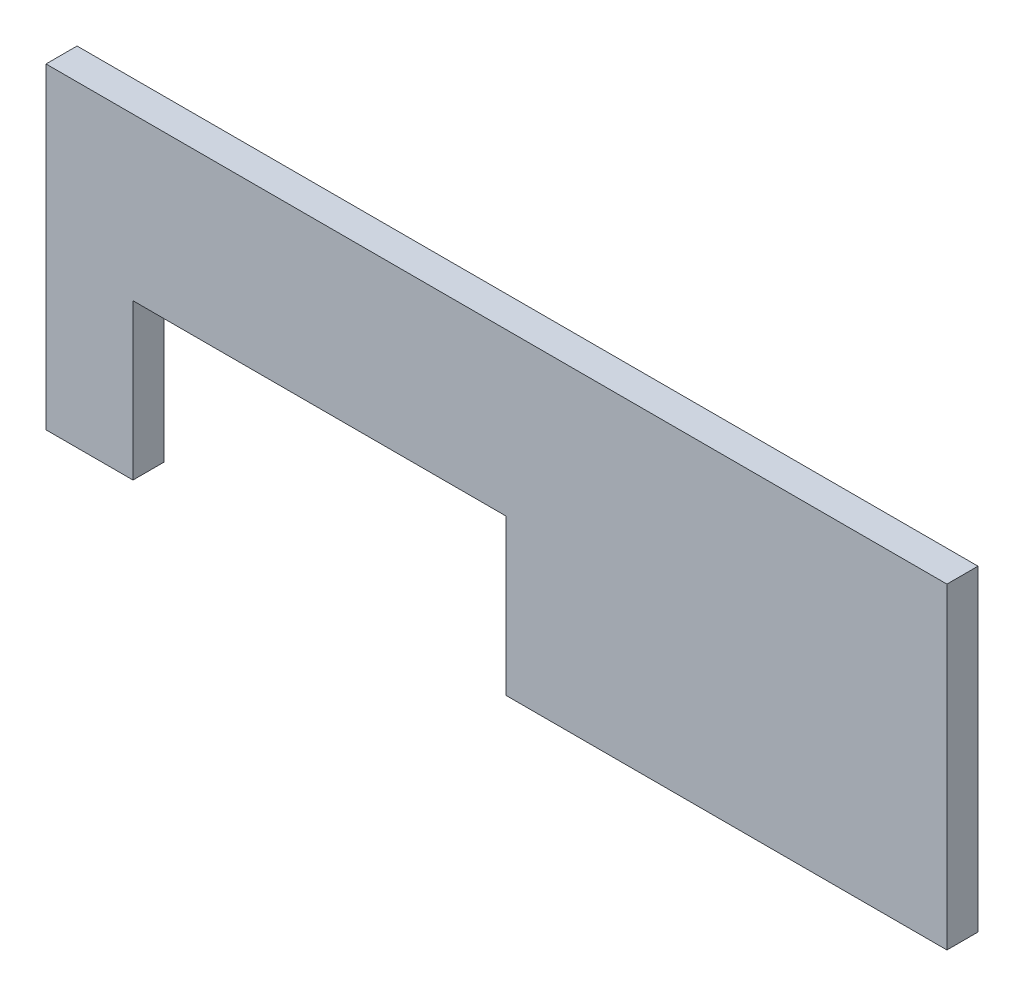
ISO-10303-21;
HEADER;
FILE_DESCRIPTION(('STEP AP214'),'2;1');
FILE_NAME('part.step','',(''),(''),'','','');
FILE_SCHEMA(('AUTOMOTIVE_DESIGN { 1 0 10303 214 1 1 1 1 }'));
ENDSEC;
DATA;
#1=APPLICATION_CONTEXT('core data for automotive mechanical design processes');
#2=APPLICATION_PROTOCOL_DEFINITION('international standard','automotive_design',2000,#1);
#3=PRODUCT_CONTEXT('',#1,'mechanical');
#4=PRODUCT('Part','Part','',(#3));
#5=PRODUCT_RELATED_PRODUCT_CATEGORY('part','',(#4));
#6=PRODUCT_DEFINITION_FORMATION('','',#4);
#7=PRODUCT_DEFINITION_CONTEXT('part definition',#1,'design');
#8=PRODUCT_DEFINITION('design','',#6,#7);
#9=PRODUCT_DEFINITION_SHAPE('','',#8);
#10=(LENGTH_UNIT() NAMED_UNIT(*) SI_UNIT(.MILLI.,.METRE.));
#11=(NAMED_UNIT(*) PLANE_ANGLE_UNIT() SI_UNIT($,.RADIAN.));
#12=(NAMED_UNIT(*) SI_UNIT($,.STERADIAN.) SOLID_ANGLE_UNIT());
#13=UNCERTAINTY_MEASURE_WITH_UNIT(LENGTH_MEASURE(1.E-05),#10,'distance_accuracy_value','');
#14=(GEOMETRIC_REPRESENTATION_CONTEXT(3) GLOBAL_UNCERTAINTY_ASSIGNED_CONTEXT((#13)) GLOBAL_UNIT_ASSIGNED_CONTEXT((#10,
#11,#12)) REPRESENTATION_CONTEXT('',''));
#15=CARTESIAN_POINT('',(0.,0.,0.));
#16=DIRECTION('',(0.,0.,1.));
#17=DIRECTION('',(1.,0.,0.));
#18=AXIS2_PLACEMENT_3D('',#15,#16,#17);
#19=CARTESIAN_POINT('',(-48.7494483294484,2.8376923076923,5.));
#20=DIRECTION('',(1.,0.,0.));
#21=DIRECTION('',(0.,1.,0.));
#22=AXIS2_PLACEMENT_3D('',#19,#20,#21);
#23=PLANE('',#22);
#24=DIRECTION('',(0.,-1.,0.));
#25=VECTOR('',#24,1.);
#26=CARTESIAN_POINT('',(-48.7494483294484,2.8376923076923,0.));
#27=LINE('',#26,#25);
#28=CARTESIAN_POINT('',(-48.7494483294484,2.8376923076923,0.));
#29=VERTEX_POINT('',#28);
#30=CARTESIAN_POINT('',(-48.7494483294484,-48.1623076923077,0.));
#31=VERTEX_POINT('',#30);
#32=EDGE_CURVE('E126',#29,#31,#27,.T.);
#33=ORIENTED_EDGE('',*,*,#32,.T.);
#34=DIRECTION('',(0.,0.,-1.));
#35=VECTOR('',#34,1.);
#36=CARTESIAN_POINT('',(-48.7494483294484,-48.1623076923077,5.));
#37=LINE('',#36,#35);
#38=CARTESIAN_POINT('',(-48.7494483294484,-48.1623076923077,5.));
#39=VERTEX_POINT('',#38);
#40=EDGE_CURVE('E11',#39,#31,#37,.T.);
#41=ORIENTED_EDGE('',*,*,#40,.F.);
#42=DIRECTION('',(0.,-1.,0.));
#43=VECTOR('',#42,1.);
#44=CARTESIAN_POINT('',(-48.7494483294484,2.8376923076923,5.));
#45=LINE('',#44,#43);
#46=CARTESIAN_POINT('',(-48.7494483294484,2.8376923076923,5.));
#47=VERTEX_POINT('',#46);
#48=EDGE_CURVE('E140',#47,#39,#45,.T.);
#49=ORIENTED_EDGE('',*,*,#48,.F.);
#50=DIRECTION('',(0.,0.,-1.));
#51=VECTOR('',#50,1.);
#52=CARTESIAN_POINT('',(-48.7494483294484,2.8376923076923,5.));
#53=LINE('',#52,#51);
#54=EDGE_CURVE('E122',#47,#29,#53,.T.);
#55=ORIENTED_EDGE('',*,*,#54,.T.);
#56=EDGE_LOOP('',(#33,#41,#49,#55));
#57=FACE_BOUND('',#56,.T.);
#58=ADVANCED_FACE('F30',(#57),#23,.F.);
#59=CARTESIAN_POINT('',(-48.7494483294484,-48.1623076923077,5.));
#60=DIRECTION('',(0.,1.,0.));
#61=DIRECTION('',(0.,0.,1.));
#62=AXIS2_PLACEMENT_3D('',#59,#60,#61);
#63=PLANE('',#62);
#64=DIRECTION('',(1.,0.,0.));
#65=VECTOR('',#64,1.);
#66=CARTESIAN_POINT('',(-48.7494483294484,-48.1623076923077,0.));
#67=LINE('',#66,#65);
#68=CARTESIAN_POINT('',(-34.7494483294484,-48.1623076923077,0.));
#69=VERTEX_POINT('',#68);
#70=EDGE_CURVE('E129',#31,#69,#67,.T.);
#71=ORIENTED_EDGE('',*,*,#70,.T.);
#72=DIRECTION('',(0.,0.,-1.));
#73=VECTOR('',#72,1.);
#74=CARTESIAN_POINT('',(-34.7494483294484,-48.1623076923077,5.));
#75=LINE('',#74,#73);
#76=CARTESIAN_POINT('',(-34.7494483294484,-48.1623076923077,5.));
#77=VERTEX_POINT('',#76);
#78=EDGE_CURVE('E38',#77,#69,#75,.T.);
#79=ORIENTED_EDGE('',*,*,#78,.F.);
#80=DIRECTION('',(1.,0.,0.));
#81=VECTOR('',#80,1.);
#82=CARTESIAN_POINT('',(-48.7494483294484,-48.1623076923077,5.));
#83=LINE('',#82,#81);
#84=EDGE_CURVE('E89',#39,#77,#83,.T.);
#85=ORIENTED_EDGE('',*,*,#84,.F.);
#86=ORIENTED_EDGE('',*,*,#40,.T.);
#87=EDGE_LOOP('',(#71,#79,#85,#86));
#88=FACE_BOUND('',#87,.T.);
#89=ADVANCED_FACE('F175',(#88),#63,.F.);
#90=CARTESIAN_POINT('',(-34.7494483294484,-48.1623076923077,5.));
#91=DIRECTION('',(-1.,0.,0.));
#92=DIRECTION('',(0.,0.,1.));
#93=AXIS2_PLACEMENT_3D('',#90,#91,#92);
#94=PLANE('',#93);
#95=DIRECTION('',(0.,1.,0.));
#96=VECTOR('',#95,1.);
#97=CARTESIAN_POINT('',(-34.7494483294484,-48.1623076923077,0.));
#98=LINE('',#97,#96);
#99=CARTESIAN_POINT('',(-34.7494483294484,-23.1623076923077,0.));
#100=VERTEX_POINT('',#99);
#101=EDGE_CURVE('E131',#69,#100,#98,.T.);
#102=ORIENTED_EDGE('',*,*,#101,.T.);
#103=DIRECTION('',(0.,0.,-1.));
#104=VECTOR('',#103,1.);
#105=CARTESIAN_POINT('',(-34.7494483294484,-23.1623076923077,5.));
#106=LINE('',#105,#104);
#107=CARTESIAN_POINT('',(-34.7494483294484,-23.1623076923077,5.));
#108=VERTEX_POINT('',#107);
#109=EDGE_CURVE('E147',#108,#100,#106,.T.);
#110=ORIENTED_EDGE('',*,*,#109,.F.);
#111=DIRECTION('',(0.,1.,0.));
#112=VECTOR('',#111,1.);
#113=CARTESIAN_POINT('',(-34.7494483294484,-48.1623076923077,5.));
#114=LINE('',#113,#112);
#115=EDGE_CURVE('E155',#77,#108,#114,.T.);
#116=ORIENTED_EDGE('',*,*,#115,.F.);
#117=ORIENTED_EDGE('',*,*,#78,.T.);
#118=EDGE_LOOP('',(#102,#110,#116,#117));
#119=FACE_BOUND('',#118,.T.);
#120=ADVANCED_FACE('F153',(#119),#94,.F.);
#121=CARTESIAN_POINT('',(-34.7494483294484,-23.1623076923077,5.));
#122=DIRECTION('',(0.,1.,0.));
#123=DIRECTION('',(0.,0.,1.));
#124=AXIS2_PLACEMENT_3D('',#121,#122,#123);
#125=PLANE('',#124);
#126=DIRECTION('',(1.,0.,0.));
#127=VECTOR('',#126,1.);
#128=CARTESIAN_POINT('',(-34.7494483294484,-23.1623076923077,0.));
#129=LINE('',#128,#127);
#130=CARTESIAN_POINT('',(25.2505516705516,-23.1623076923077,0.));
#131=VERTEX_POINT('',#130);
#132=EDGE_CURVE('E133',#100,#131,#129,.T.);
#133=ORIENTED_EDGE('',*,*,#132,.T.);
#134=DIRECTION('',(0.,0.,-1.));
#135=VECTOR('',#134,1.);
#136=CARTESIAN_POINT('',(25.2505516705516,-23.1623076923077,5.));
#137=LINE('',#136,#135);
#138=CARTESIAN_POINT('',(25.2505516705516,-23.1623076923077,5.));
#139=VERTEX_POINT('',#138);
#140=EDGE_CURVE('E144',#139,#131,#137,.T.);
#141=ORIENTED_EDGE('',*,*,#140,.F.);
#142=DIRECTION('',(1.,0.,0.));
#143=VECTOR('',#142,1.);
#144=CARTESIAN_POINT('',(-34.7494483294484,-23.1623076923077,5.));
#145=LINE('',#144,#143);
#146=EDGE_CURVE('E167',#108,#139,#145,.T.);
#147=ORIENTED_EDGE('',*,*,#146,.F.);
#148=ORIENTED_EDGE('',*,*,#109,.T.);
#149=EDGE_LOOP('',(#133,#141,#147,#148));
#150=FACE_BOUND('',#149,.T.);
#151=ADVANCED_FACE('F163',(#150),#125,.F.);
#152=CARTESIAN_POINT('',(25.2505516705516,-23.1623076923077,5.));
#153=DIRECTION('',(1.,0.,0.));
#154=DIRECTION('',(0.,1.,0.));
#155=AXIS2_PLACEMENT_3D('',#152,#153,#154);
#156=PLANE('',#155);
#157=DIRECTION('',(0.,-1.,0.));
#158=VECTOR('',#157,1.);
#159=CARTESIAN_POINT('',(25.2505516705516,-23.1623076923077,0.));
#160=LINE('',#159,#158);
#161=CARTESIAN_POINT('',(25.2505516705516,-48.1623076923077,0.));
#162=VERTEX_POINT('',#161);
#163=EDGE_CURVE('E135',#131,#162,#160,.T.);
#164=ORIENTED_EDGE('',*,*,#163,.T.);
#165=DIRECTION('',(0.,0.,-1.));
#166=VECTOR('',#165,1.);
#167=CARTESIAN_POINT('',(25.2505516705516,-48.1623076923077,5.));
#168=LINE('',#167,#166);
#169=CARTESIAN_POINT('',(25.2505516705516,-48.1623076923077,5.));
#170=VERTEX_POINT('',#169);
#171=EDGE_CURVE('E117',#170,#162,#168,.T.);
#172=ORIENTED_EDGE('',*,*,#171,.F.);
#173=DIRECTION('',(0.,-1.,0.));
#174=VECTOR('',#173,1.);
#175=CARTESIAN_POINT('',(25.2505516705516,-23.1623076923077,5.));
#176=LINE('',#175,#174);
#177=EDGE_CURVE('E108',#139,#170,#176,.T.);
#178=ORIENTED_EDGE('',*,*,#177,.F.);
#179=ORIENTED_EDGE('',*,*,#140,.T.);
#180=EDGE_LOOP('',(#164,#172,#178,#179));
#181=FACE_BOUND('',#180,.T.);
#182=ADVANCED_FACE('F166',(#181),#156,.F.);
#183=CARTESIAN_POINT('',(25.2505516705516,-48.1623076923077,5.));
#184=DIRECTION('',(0.,1.,0.));
#185=DIRECTION('',(0.,0.,1.));
#186=AXIS2_PLACEMENT_3D('',#183,#184,#185);
#187=PLANE('',#186);
#188=DIRECTION('',(1.,0.,0.));
#189=VECTOR('',#188,1.);
#190=CARTESIAN_POINT('',(25.2505516705516,-48.1623076923077,0.));
#191=LINE('',#190,#189);
#192=CARTESIAN_POINT('',(96.2505516705516,-48.1623076923077,0.));
#193=VERTEX_POINT('',#192);
#194=EDGE_CURVE('E116',#162,#193,#191,.T.);
#195=ORIENTED_EDGE('',*,*,#194,.T.);
#196=DIRECTION('',(0.,0.,-1.));
#197=VECTOR('',#196,1.);
#198=CARTESIAN_POINT('',(96.2505516705516,-48.1623076923077,5.));
#199=LINE('',#198,#197);
#200=CARTESIAN_POINT('',(96.2505516705516,-48.1623076923077,5.));
#201=VERTEX_POINT('',#200);
#202=EDGE_CURVE('E113',#201,#193,#199,.T.);
#203=ORIENTED_EDGE('',*,*,#202,.F.);
#204=DIRECTION('',(1.,0.,0.));
#205=VECTOR('',#204,1.);
#206=CARTESIAN_POINT('',(25.2505516705516,-48.1623076923077,5.));
#207=LINE('',#206,#205);
#208=EDGE_CURVE('E102',#170,#201,#207,.T.);
#209=ORIENTED_EDGE('',*,*,#208,.F.);
#210=ORIENTED_EDGE('',*,*,#171,.T.);
#211=EDGE_LOOP('',(#195,#203,#209,#210));
#212=FACE_BOUND('',#211,.T.);
#213=ADVANCED_FACE('F114',(#212),#187,.F.);
#214=CARTESIAN_POINT('',(96.2505516705516,2.8376923076923,5.));
#215=DIRECTION('',(-1.,0.,0.));
#216=DIRECTION('',(0.,0.,1.));
#217=AXIS2_PLACEMENT_3D('',#214,#215,#216);
#218=PLANE('',#217);
#219=DIRECTION('',(0.,1.,0.));
#220=VECTOR('',#219,1.);
#221=CARTESIAN_POINT('',(96.2505516705516,2.8376923076923,0.));
#222=LINE('',#221,#220);
#223=CARTESIAN_POINT('',(96.2505516705516,2.8376923076923,0.));
#224=VERTEX_POINT('',#223);
#225=EDGE_CURVE('E75',#193,#224,#222,.T.);
#226=ORIENTED_EDGE('',*,*,#225,.T.);
#227=DIRECTION('',(0.,0.,-1.));
#228=VECTOR('',#227,1.);
#229=CARTESIAN_POINT('',(96.2505516705516,2.8376923076923,5.));
#230=LINE('',#229,#228);
#231=CARTESIAN_POINT('',(96.2505516705516,2.8376923076923,5.));
#232=VERTEX_POINT('',#231);
#233=EDGE_CURVE('E118',#232,#224,#230,.T.);
#234=ORIENTED_EDGE('',*,*,#233,.F.);
#235=DIRECTION('',(0.,1.,0.));
#236=VECTOR('',#235,1.);
#237=CARTESIAN_POINT('',(96.2505516705516,2.8376923076923,5.));
#238=LINE('',#237,#236);
#239=EDGE_CURVE('E106',#201,#232,#238,.T.);
#240=ORIENTED_EDGE('',*,*,#239,.F.);
#241=ORIENTED_EDGE('',*,*,#202,.T.);
#242=EDGE_LOOP('',(#226,#234,#240,#241));
#243=FACE_BOUND('',#242,.T.);
#244=ADVANCED_FACE('F120',(#243),#218,.F.);
#245=CARTESIAN_POINT('',(-48.7494483294484,2.8376923076923,5.));
#246=DIRECTION('',(0.,-1.,0.));
#247=DIRECTION('',(0.,0.,-1.));
#248=AXIS2_PLACEMENT_3D('',#245,#246,#247);
#249=PLANE('',#248);
#250=DIRECTION('',(-1.,0.,0.));
#251=VECTOR('',#250,1.);
#252=CARTESIAN_POINT('',(-48.7494483294484,2.8376923076923,0.));
#253=LINE('',#252,#251);
#254=EDGE_CURVE('E81',#224,#29,#253,.T.);
#255=ORIENTED_EDGE('',*,*,#254,.T.);
#256=ORIENTED_EDGE('',*,*,#54,.F.);
#257=DIRECTION('',(-1.,0.,0.));
#258=VECTOR('',#257,1.);
#259=CARTESIAN_POINT('',(-48.7494483294484,2.8376923076923,5.));
#260=LINE('',#259,#258);
#261=EDGE_CURVE('E46',#232,#47,#260,.T.);
#262=ORIENTED_EDGE('',*,*,#261,.F.);
#263=ORIENTED_EDGE('',*,*,#233,.T.);
#264=EDGE_LOOP('',(#255,#256,#262,#263));
#265=FACE_BOUND('',#264,.T.);
#266=ADVANCED_FACE('F191',(#265),#249,.F.);
#267=CARTESIAN_POINT('',(-48.7494483294484,-48.1623076923077,5.));
#268=DIRECTION('',(0.,0.,1.));
#269=DIRECTION('',(1.,0.,0.));
#270=AXIS2_PLACEMENT_3D('',#267,#268,#269);
#271=PLANE('',#270);
#272=ORIENTED_EDGE('',*,*,#48,.T.);
#273=ORIENTED_EDGE('',*,*,#84,.T.);
#274=ORIENTED_EDGE('',*,*,#115,.T.);
#275=ORIENTED_EDGE('',*,*,#146,.T.);
#276=ORIENTED_EDGE('',*,*,#177,.T.);
#277=ORIENTED_EDGE('',*,*,#208,.T.);
#278=ORIENTED_EDGE('',*,*,#239,.T.);
#279=ORIENTED_EDGE('',*,*,#261,.T.);
#280=EDGE_LOOP('',(#272,#273,#274,#275,#276,#277,#278,#279));
#281=FACE_BOUND('',#280,.T.);
#282=ADVANCED_FACE('F104',(#281),#271,.T.);
#283=CARTESIAN_POINT('',(-48.7494483294484,-48.1623076923077,0.));
#284=DIRECTION('',(0.,0.,1.));
#285=DIRECTION('',(1.,0.,0.));
#286=AXIS2_PLACEMENT_3D('',#283,#284,#285);
#287=PLANE('',#286);
#288=ORIENTED_EDGE('',*,*,#32,.F.);
#289=ORIENTED_EDGE('',*,*,#254,.F.);
#290=ORIENTED_EDGE('',*,*,#225,.F.);
#291=ORIENTED_EDGE('',*,*,#194,.F.);
#292=ORIENTED_EDGE('',*,*,#163,.F.);
#293=ORIENTED_EDGE('',*,*,#132,.F.);
#294=ORIENTED_EDGE('',*,*,#101,.F.);
#295=ORIENTED_EDGE('',*,*,#70,.F.);
#296=EDGE_LOOP('',(#288,#289,#290,#291,#292,#293,#294,#295));
#297=FACE_BOUND('',#296,.T.);
#298=ADVANCED_FACE('F159',(#297),#287,.F.);
#299=CLOSED_SHELL('',(#58,#89,#120,#151,#182,#213,#244,#266,#282,#298));
#300=MANIFOLD_SOLID_BREP('B2',#299);
#301=ADVANCED_BREP_SHAPE_REPRESENTATION('',(#18,#300),#14);
#302=SHAPE_DEFINITION_REPRESENTATION(#9,#301);
ENDSEC;
END-ISO-10303-21;
